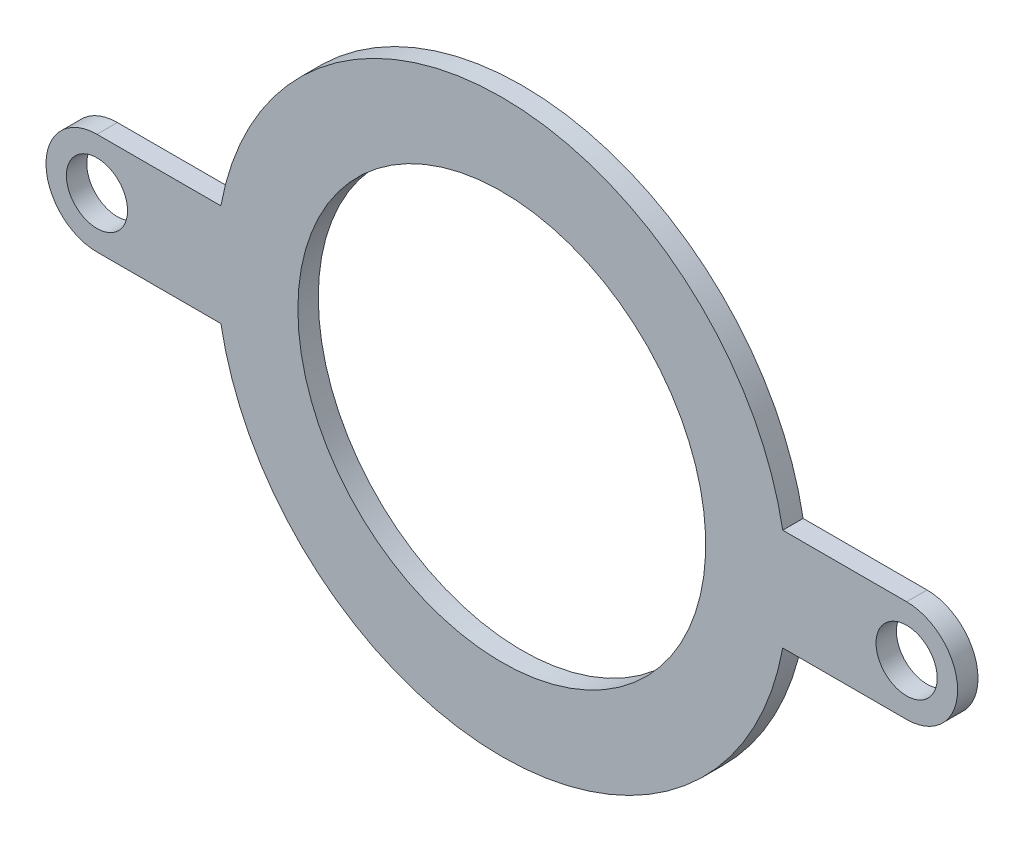
ISO-10303-21;
HEADER;
FILE_DESCRIPTION(('STEP AP214'),'2;1');
FILE_NAME('part.step','',(''),(''),'','','');
FILE_SCHEMA(('AUTOMOTIVE_DESIGN { 1 0 10303 214 1 1 1 1 }'));
ENDSEC;
DATA;
#1=APPLICATION_CONTEXT('core data for automotive mechanical design processes');
#2=APPLICATION_PROTOCOL_DEFINITION('international standard','automotive_design',2000,#1);
#3=PRODUCT_CONTEXT('',#1,'mechanical');
#4=PRODUCT('Part','Part','',(#3));
#5=PRODUCT_RELATED_PRODUCT_CATEGORY('part','',(#4));
#6=PRODUCT_DEFINITION_FORMATION('','',#4);
#7=PRODUCT_DEFINITION_CONTEXT('part definition',#1,'design');
#8=PRODUCT_DEFINITION('design','',#6,#7);
#9=PRODUCT_DEFINITION_SHAPE('','',#8);
#10=(LENGTH_UNIT() NAMED_UNIT(*) SI_UNIT(.MILLI.,.METRE.));
#11=(NAMED_UNIT(*) PLANE_ANGLE_UNIT() SI_UNIT($,.RADIAN.));
#12=(NAMED_UNIT(*) SI_UNIT($,.STERADIAN.) SOLID_ANGLE_UNIT());
#13=UNCERTAINTY_MEASURE_WITH_UNIT(LENGTH_MEASURE(1.E-05),#10,'distance_accuracy_value','');
#14=(GEOMETRIC_REPRESENTATION_CONTEXT(3) GLOBAL_UNCERTAINTY_ASSIGNED_CONTEXT((#13)) GLOBAL_UNIT_ASSIGNED_CONTEXT((#10,
#11,#12)) REPRESENTATION_CONTEXT('',''));
#15=CARTESIAN_POINT('',(0.,0.,0.));
#16=DIRECTION('',(0.,0.,1.));
#17=DIRECTION('',(1.,0.,0.));
#18=AXIS2_PLACEMENT_3D('',#15,#16,#17);
#19=CARTESIAN_POINT('',(0.,0.,0.));
#20=DIRECTION('',(0.,0.,1.));
#21=DIRECTION('',(1.,0.,0.));
#22=AXIS2_PLACEMENT_3D('',#19,#20,#21);
#23=PLANE('',#22);
#24=CARTESIAN_POINT('',(-19.85,0.,0.));
#25=DIRECTION('',(0.,0.,-1.));
#26=DIRECTION('',(-1.,0.,0.));
#27=AXIS2_PLACEMENT_3D('',#24,#25,#26);
#28=CIRCLE('',#27,2.5);
#29=CARTESIAN_POINT('',(-19.85,2.5,0.));
#30=VERTEX_POINT('',#29);
#31=CARTESIAN_POINT('',(-19.85,-2.5,0.));
#32=VERTEX_POINT('',#31);
#33=EDGE_CURVE('E139',#30,#32,#28,.F.);
#34=ORIENTED_EDGE('',*,*,#33,.F.);
#35=DIRECTION('',(1.,0.,0.));
#36=VECTOR('',#35,1.);
#37=CARTESIAN_POINT('',(-16.8124886569779,2.5,0.));
#38=LINE('',#37,#36);
#39=CARTESIAN_POINT('',(-13.7749773139559,2.5,0.));
#40=VERTEX_POINT('',#39);
#41=EDGE_CURVE('E110',#40,#30,#38,.F.);
#42=ORIENTED_EDGE('',*,*,#41,.F.);
#43=CARTESIAN_POINT('',(0.,0.,0.));
#44=DIRECTION('',(0.,0.,-1.));
#45=DIRECTION('',(-1.,0.,0.));
#46=AXIS2_PLACEMENT_3D('',#43,#44,#45);
#47=CIRCLE('',#46,14.);
#48=CARTESIAN_POINT('',(13.7749773139559,2.5,0.));
#49=VERTEX_POINT('',#48);
#50=EDGE_CURVE('E117',#49,#40,#47,.F.);
#51=ORIENTED_EDGE('',*,*,#50,.F.);
#52=DIRECTION('',(1.,0.,0.));
#53=VECTOR('',#52,1.);
#54=CARTESIAN_POINT('',(16.8124886569779,2.5,0.));
#55=LINE('',#54,#53);
#56=CARTESIAN_POINT('',(19.85,2.5,0.));
#57=VERTEX_POINT('',#56);
#58=EDGE_CURVE('E116',#49,#57,#55,.T.);
#59=ORIENTED_EDGE('',*,*,#58,.T.);
#60=CARTESIAN_POINT('',(19.85,0.,0.));
#61=DIRECTION('',(0.,0.,-1.));
#62=DIRECTION('',(-1.,0.,0.));
#63=AXIS2_PLACEMENT_3D('',#60,#61,#62);
#64=CIRCLE('',#63,2.5);
#65=CARTESIAN_POINT('',(19.85,-2.5,0.));
#66=VERTEX_POINT('',#65);
#67=EDGE_CURVE('E85',#66,#57,#64,.F.);
#68=ORIENTED_EDGE('',*,*,#67,.F.);
#69=DIRECTION('',(1.,0.,0.));
#70=VECTOR('',#69,1.);
#71=CARTESIAN_POINT('',(16.8124886569779,-2.5,0.));
#72=LINE('',#71,#70);
#73=CARTESIAN_POINT('',(13.7749773139559,-2.5,0.));
#74=VERTEX_POINT('',#73);
#75=EDGE_CURVE('E82',#74,#66,#72,.T.);
#76=ORIENTED_EDGE('',*,*,#75,.F.);
#77=CARTESIAN_POINT('',(0.,0.,0.));
#78=DIRECTION('',(0.,0.,-1.));
#79=DIRECTION('',(-1.,0.,0.));
#80=AXIS2_PLACEMENT_3D('',#77,#78,#79);
#81=CIRCLE('',#80,14.);
#82=CARTESIAN_POINT('',(-13.7749773139559,-2.50000000000001,0.));
#83=VERTEX_POINT('',#82);
#84=EDGE_CURVE('E79',#83,#74,#81,.F.);
#85=ORIENTED_EDGE('',*,*,#84,.F.);
#86=DIRECTION('',(1.,0.,0.));
#87=VECTOR('',#86,1.);
#88=CARTESIAN_POINT('',(-16.8124886569779,-2.5,0.));
#89=LINE('',#88,#87);
#90=EDGE_CURVE('E97',#83,#32,#89,.F.);
#91=ORIENTED_EDGE('',*,*,#90,.T.);
#92=EDGE_LOOP('',(#34,#42,#51,#59,#68,#76,#85,#91));
#93=FACE_BOUND('',#92,.T.);
#94=CARTESIAN_POINT('',(0.,0.,0.));
#95=DIRECTION('',(0.,0.,-1.));
#96=DIRECTION('',(-1.,0.,0.));
#97=AXIS2_PLACEMENT_3D('',#94,#95,#96);
#98=CIRCLE('',#97,10.);
#99=CARTESIAN_POINT('',(-10.,0.,0.));
#100=VERTEX_POINT('',#99);
#101=EDGE_CURVE('E115',#100,#100,#98,.F.);
#102=ORIENTED_EDGE('',*,*,#101,.T.);
#103=EDGE_LOOP('',(#102));
#104=FACE_BOUND('',#103,.T.);
#105=CARTESIAN_POINT('',(19.85,0.,0.));
#106=DIRECTION('',(0.,0.,-1.));
#107=DIRECTION('',(-1.,0.,0.));
#108=AXIS2_PLACEMENT_3D('',#105,#106,#107);
#109=CIRCLE('',#108,1.5);
#110=CARTESIAN_POINT('',(18.35,0.,0.));
#111=VERTEX_POINT('',#110);
#112=EDGE_CURVE('E146',#111,#111,#109,.F.);
#113=ORIENTED_EDGE('',*,*,#112,.T.);
#114=EDGE_LOOP('',(#113));
#115=FACE_BOUND('',#114,.T.);
#116=CARTESIAN_POINT('',(-19.85,0.,0.));
#117=DIRECTION('',(0.,0.,-1.));
#118=DIRECTION('',(-1.,0.,0.));
#119=AXIS2_PLACEMENT_3D('',#116,#117,#118);
#120=CIRCLE('',#119,1.5);
#121=CARTESIAN_POINT('',(-21.35,0.,0.));
#122=VERTEX_POINT('',#121);
#123=EDGE_CURVE('E19',#122,#122,#120,.F.);
#124=ORIENTED_EDGE('',*,*,#123,.T.);
#125=EDGE_LOOP('',(#124));
#126=FACE_BOUND('',#125,.T.);
#127=ADVANCED_FACE('F16',(#93,#104,#115,#126),#23,.F.);
#128=CARTESIAN_POINT('',(-19.85,0.,1.));
#129=DIRECTION('',(0.,0.,-1.));
#130=DIRECTION('',(-1.,0.,0.));
#131=AXIS2_PLACEMENT_3D('',#128,#129,#130);
#132=CYLINDRICAL_SURFACE('',#131,1.5);
#133=ORIENTED_EDGE('',*,*,#123,.F.);
#134=EDGE_LOOP('',(#133));
#135=FACE_BOUND('',#134,.T.);
#136=CARTESIAN_POINT('',(-19.85,0.,1.));
#137=DIRECTION('',(0.,0.,-1.));
#138=DIRECTION('',(-1.,0.,0.));
#139=AXIS2_PLACEMENT_3D('',#136,#137,#138);
#140=CIRCLE('',#139,1.5);
#141=CARTESIAN_POINT('',(-21.35,0.,1.));
#142=VERTEX_POINT('',#141);
#143=EDGE_CURVE('E136',#142,#142,#140,.T.);
#144=ORIENTED_EDGE('',*,*,#143,.F.);
#145=EDGE_LOOP('',(#144));
#146=FACE_BOUND('',#145,.T.);
#147=ADVANCED_FACE('F154',(#135,#146),#132,.F.);
#148=CARTESIAN_POINT('',(19.85,0.,1.));
#149=DIRECTION('',(0.,0.,-1.));
#150=DIRECTION('',(-1.,0.,0.));
#151=AXIS2_PLACEMENT_3D('',#148,#149,#150);
#152=CYLINDRICAL_SURFACE('',#151,1.5);
#153=ORIENTED_EDGE('',*,*,#112,.F.);
#154=EDGE_LOOP('',(#153));
#155=FACE_BOUND('',#154,.T.);
#156=CARTESIAN_POINT('',(19.85,0.,1.));
#157=DIRECTION('',(0.,0.,-1.));
#158=DIRECTION('',(-1.,0.,0.));
#159=AXIS2_PLACEMENT_3D('',#156,#157,#158);
#160=CIRCLE('',#159,1.5);
#161=CARTESIAN_POINT('',(18.35,0.,1.));
#162=VERTEX_POINT('',#161);
#163=EDGE_CURVE('E133',#162,#162,#160,.T.);
#164=ORIENTED_EDGE('',*,*,#163,.F.);
#165=EDGE_LOOP('',(#164));
#166=FACE_BOUND('',#165,.T.);
#167=ADVANCED_FACE('F157',(#155,#166),#152,.F.);
#168=CARTESIAN_POINT('',(0.,0.,1.));
#169=DIRECTION('',(0.,0.,-1.));
#170=DIRECTION('',(-1.,0.,0.));
#171=AXIS2_PLACEMENT_3D('',#168,#169,#170);
#172=CYLINDRICAL_SURFACE('',#171,10.);
#173=ORIENTED_EDGE('',*,*,#101,.F.);
#174=EDGE_LOOP('',(#173));
#175=FACE_BOUND('',#174,.T.);
#176=CARTESIAN_POINT('',(0.,0.,1.));
#177=DIRECTION('',(0.,0.,-1.));
#178=DIRECTION('',(-1.,0.,0.));
#179=AXIS2_PLACEMENT_3D('',#176,#177,#178);
#180=CIRCLE('',#179,10.);
#181=CARTESIAN_POINT('',(-10.,0.,1.));
#182=VERTEX_POINT('',#181);
#183=EDGE_CURVE('E130',#182,#182,#180,.T.);
#184=ORIENTED_EDGE('',*,*,#183,.F.);
#185=EDGE_LOOP('',(#184));
#186=FACE_BOUND('',#185,.T.);
#187=ADVANCED_FACE('F196',(#175,#186),#172,.F.);
#188=CARTESIAN_POINT('',(-16.8124886569779,-2.5,1.));
#189=DIRECTION('',(0.,1.,0.));
#190=DIRECTION('',(0.,0.,1.));
#191=AXIS2_PLACEMENT_3D('',#188,#189,#190);
#192=PLANE('',#191);
#193=DIRECTION('',(0.,0.,-1.));
#194=VECTOR('',#193,1.);
#195=CARTESIAN_POINT('',(-13.7749773139559,-2.50000000000001,1.));
#196=LINE('',#195,#194);
#197=CARTESIAN_POINT('',(-13.7749773139559,-2.50000000000001,1.));
#198=VERTEX_POINT('',#197);
#199=EDGE_CURVE('E90',#198,#83,#196,.T.);
#200=ORIENTED_EDGE('',*,*,#199,.F.);
#201=DIRECTION('',(1.,0.,0.));
#202=VECTOR('',#201,1.);
#203=CARTESIAN_POINT('',(0.,-2.5,1.));
#204=LINE('',#203,#202);
#205=CARTESIAN_POINT('',(-19.85,-2.5,1.));
#206=VERTEX_POINT('',#205);
#207=EDGE_CURVE('E129',#206,#198,#204,.T.);
#208=ORIENTED_EDGE('',*,*,#207,.F.);
#209=DIRECTION('',(0.,0.,-1.));
#210=VECTOR('',#209,1.);
#211=CARTESIAN_POINT('',(-19.85,-2.5,1.));
#212=LINE('',#211,#210);
#213=EDGE_CURVE('E142',#32,#206,#212,.F.);
#214=ORIENTED_EDGE('',*,*,#213,.F.);
#215=ORIENTED_EDGE('',*,*,#90,.F.);
#216=EDGE_LOOP('',(#200,#208,#214,#215));
#217=FACE_BOUND('',#216,.T.);
#218=ADVANCED_FACE('F193',(#217),#192,.F.);
#219=CARTESIAN_POINT('',(0.,0.,1.));
#220=DIRECTION('',(0.,0.,-1.));
#221=DIRECTION('',(-1.,0.,0.));
#222=AXIS2_PLACEMENT_3D('',#219,#220,#221);
#223=CYLINDRICAL_SURFACE('',#222,14.);
#224=CARTESIAN_POINT('',(0.,0.,1.));
#225=DIRECTION('',(0.,0.,-1.));
#226=DIRECTION('',(-1.,0.,0.));
#227=AXIS2_PLACEMENT_3D('',#224,#225,#226);
#228=CIRCLE('',#227,14.);
#229=CARTESIAN_POINT('',(13.7749773139559,-2.5,1.));
#230=VERTEX_POINT('',#229);
#231=EDGE_CURVE('E127',#198,#230,#228,.F.);
#232=ORIENTED_EDGE('',*,*,#231,.F.);
#233=ORIENTED_EDGE('',*,*,#199,.T.);
#234=ORIENTED_EDGE('',*,*,#84,.T.);
#235=DIRECTION('',(0.,0.,1.));
#236=VECTOR('',#235,1.);
#237=CARTESIAN_POINT('',(13.7749773139559,-2.5,1.));
#238=LINE('',#237,#236);
#239=EDGE_CURVE('E89',#230,#74,#238,.F.);
#240=ORIENTED_EDGE('',*,*,#239,.F.);
#241=EDGE_LOOP('',(#232,#233,#234,#240));
#242=FACE_BOUND('',#241,.T.);
#243=ADVANCED_FACE('F95',(#242),#223,.T.);
#244=CARTESIAN_POINT('',(16.8124886569779,-2.5,1.));
#245=DIRECTION('',(0.,-1.,0.));
#246=DIRECTION('',(1.,0.,0.));
#247=AXIS2_PLACEMENT_3D('',#244,#245,#246);
#248=PLANE('',#247);
#249=DIRECTION('',(1.,0.,0.));
#250=VECTOR('',#249,1.);
#251=CARTESIAN_POINT('',(0.,-2.5,1.));
#252=LINE('',#251,#250);
#253=CARTESIAN_POINT('',(19.85,-2.5,1.));
#254=VERTEX_POINT('',#253);
#255=EDGE_CURVE('E101',#230,#254,#252,.T.);
#256=ORIENTED_EDGE('',*,*,#255,.F.);
#257=ORIENTED_EDGE('',*,*,#239,.T.);
#258=ORIENTED_EDGE('',*,*,#75,.T.);
#259=DIRECTION('',(0.,0.,-1.));
#260=VECTOR('',#259,1.);
#261=CARTESIAN_POINT('',(19.85,-2.5,1.));
#262=LINE('',#261,#260);
#263=EDGE_CURVE('E104',#254,#66,#262,.T.);
#264=ORIENTED_EDGE('',*,*,#263,.F.);
#265=EDGE_LOOP('',(#256,#257,#258,#264));
#266=FACE_BOUND('',#265,.T.);
#267=ADVANCED_FACE('F99',(#266),#248,.T.);
#268=CARTESIAN_POINT('',(19.85,0.,1.));
#269=DIRECTION('',(0.,0.,-1.));
#270=DIRECTION('',(-1.,0.,0.));
#271=AXIS2_PLACEMENT_3D('',#268,#269,#270);
#272=CYLINDRICAL_SURFACE('',#271,2.5);
#273=CARTESIAN_POINT('',(19.85,0.,1.));
#274=DIRECTION('',(0.,0.,-1.));
#275=DIRECTION('',(-1.,0.,0.));
#276=AXIS2_PLACEMENT_3D('',#273,#274,#275);
#277=CIRCLE('',#276,2.5);
#278=CARTESIAN_POINT('',(19.85,2.5,1.));
#279=VERTEX_POINT('',#278);
#280=EDGE_CURVE('E124',#254,#279,#277,.F.);
#281=ORIENTED_EDGE('',*,*,#280,.F.);
#282=ORIENTED_EDGE('',*,*,#263,.T.);
#283=ORIENTED_EDGE('',*,*,#67,.T.);
#284=DIRECTION('',(0.,0.,-1.));
#285=VECTOR('',#284,1.);
#286=CARTESIAN_POINT('',(19.85,2.5,1.));
#287=LINE('',#286,#285);
#288=EDGE_CURVE('E118',#57,#279,#287,.F.);
#289=ORIENTED_EDGE('',*,*,#288,.T.);
#290=EDGE_LOOP('',(#281,#282,#283,#289));
#291=FACE_BOUND('',#290,.T.);
#292=ADVANCED_FACE('F184',(#291),#272,.T.);
#293=CARTESIAN_POINT('',(16.8124886569779,2.5,1.));
#294=DIRECTION('',(0.,-1.,0.));
#295=DIRECTION('',(0.,0.,-1.));
#296=AXIS2_PLACEMENT_3D('',#293,#294,#295);
#297=PLANE('',#296);
#298=DIRECTION('',(0.,0.,-1.));
#299=VECTOR('',#298,1.);
#300=CARTESIAN_POINT('',(13.7749773139559,2.5,1.));
#301=LINE('',#300,#299);
#302=CARTESIAN_POINT('',(13.7749773139559,2.5,1.));
#303=VERTEX_POINT('',#302);
#304=EDGE_CURVE('E113',#303,#49,#301,.T.);
#305=ORIENTED_EDGE('',*,*,#304,.F.);
#306=DIRECTION('',(1.,0.,0.));
#307=VECTOR('',#306,1.);
#308=CARTESIAN_POINT('',(0.,2.5,1.));
#309=LINE('',#308,#307);
#310=EDGE_CURVE('E123',#279,#303,#309,.F.);
#311=ORIENTED_EDGE('',*,*,#310,.F.);
#312=ORIENTED_EDGE('',*,*,#288,.F.);
#313=ORIENTED_EDGE('',*,*,#58,.F.);
#314=EDGE_LOOP('',(#305,#311,#312,#313));
#315=FACE_BOUND('',#314,.T.);
#316=ADVANCED_FACE('F180',(#315),#297,.F.);
#317=CARTESIAN_POINT('',(0.,0.,1.));
#318=DIRECTION('',(0.,0.,-1.));
#319=DIRECTION('',(-1.,0.,0.));
#320=AXIS2_PLACEMENT_3D('',#317,#318,#319);
#321=CYLINDRICAL_SURFACE('',#320,14.);
#322=CARTESIAN_POINT('',(0.,0.,1.));
#323=DIRECTION('',(0.,0.,-1.));
#324=DIRECTION('',(-1.,0.,0.));
#325=AXIS2_PLACEMENT_3D('',#322,#323,#324);
#326=CIRCLE('',#325,14.);
#327=CARTESIAN_POINT('',(-13.7749773139559,2.5,1.));
#328=VERTEX_POINT('',#327);
#329=EDGE_CURVE('E120',#303,#328,#326,.F.);
#330=ORIENTED_EDGE('',*,*,#329,.F.);
#331=ORIENTED_EDGE('',*,*,#304,.T.);
#332=ORIENTED_EDGE('',*,*,#50,.T.);
#333=DIRECTION('',(0.,0.,1.));
#334=VECTOR('',#333,1.);
#335=CARTESIAN_POINT('',(-13.7749773139559,2.5,1.));
#336=LINE('',#335,#334);
#337=EDGE_CURVE('E112',#328,#40,#336,.F.);
#338=ORIENTED_EDGE('',*,*,#337,.F.);
#339=EDGE_LOOP('',(#330,#331,#332,#338));
#340=FACE_BOUND('',#339,.T.);
#341=ADVANCED_FACE('F177',(#340),#321,.T.);
#342=CARTESIAN_POINT('',(-16.8124886569779,2.5,1.));
#343=DIRECTION('',(0.,1.,0.));
#344=DIRECTION('',(0.,0.,1.));
#345=AXIS2_PLACEMENT_3D('',#342,#343,#344);
#346=PLANE('',#345);
#347=DIRECTION('',(1.,0.,0.));
#348=VECTOR('',#347,1.);
#349=CARTESIAN_POINT('',(0.,2.5,1.));
#350=LINE('',#349,#348);
#351=CARTESIAN_POINT('',(-19.85,2.5,1.));
#352=VERTEX_POINT('',#351);
#353=EDGE_CURVE('E25',#328,#352,#350,.F.);
#354=ORIENTED_EDGE('',*,*,#353,.F.);
#355=ORIENTED_EDGE('',*,*,#337,.T.);
#356=ORIENTED_EDGE('',*,*,#41,.T.);
#357=DIRECTION('',(0.,0.,-1.));
#358=VECTOR('',#357,1.);
#359=CARTESIAN_POINT('',(-19.85,2.5,1.));
#360=LINE('',#359,#358);
#361=EDGE_CURVE('E34',#352,#30,#360,.T.);
#362=ORIENTED_EDGE('',*,*,#361,.F.);
#363=EDGE_LOOP('',(#354,#355,#356,#362));
#364=FACE_BOUND('',#363,.T.);
#365=ADVANCED_FACE('F169',(#364),#346,.T.);
#366=CARTESIAN_POINT('',(-19.85,0.,1.));
#367=DIRECTION('',(0.,0.,-1.));
#368=DIRECTION('',(-1.,0.,0.));
#369=AXIS2_PLACEMENT_3D('',#366,#367,#368);
#370=CYLINDRICAL_SURFACE('',#369,2.5);
#371=CARTESIAN_POINT('',(-19.85,0.,1.));
#372=DIRECTION('',(0.,0.,-1.));
#373=DIRECTION('',(-1.,0.,0.));
#374=AXIS2_PLACEMENT_3D('',#371,#372,#373);
#375=CIRCLE('',#374,2.5);
#376=EDGE_CURVE('E10',#352,#206,#375,.F.);
#377=ORIENTED_EDGE('',*,*,#376,.F.);
#378=ORIENTED_EDGE('',*,*,#361,.T.);
#379=ORIENTED_EDGE('',*,*,#33,.T.);
#380=ORIENTED_EDGE('',*,*,#213,.T.);
#381=EDGE_LOOP('',(#377,#378,#379,#380));
#382=FACE_BOUND('',#381,.T.);
#383=ADVANCED_FACE('F162',(#382),#370,.T.);
#384=CARTESIAN_POINT('',(0.,0.,1.));
#385=DIRECTION('',(0.,0.,1.));
#386=DIRECTION('',(1.,0.,0.));
#387=AXIS2_PLACEMENT_3D('',#384,#385,#386);
#388=PLANE('',#387);
#389=ORIENTED_EDGE('',*,*,#353,.T.);
#390=ORIENTED_EDGE('',*,*,#376,.T.);
#391=ORIENTED_EDGE('',*,*,#207,.T.);
#392=ORIENTED_EDGE('',*,*,#231,.T.);
#393=ORIENTED_EDGE('',*,*,#255,.T.);
#394=ORIENTED_EDGE('',*,*,#280,.T.);
#395=ORIENTED_EDGE('',*,*,#310,.T.);
#396=ORIENTED_EDGE('',*,*,#329,.T.);
#397=EDGE_LOOP('',(#389,#390,#391,#392,#393,#394,#395,#396));
#398=FACE_BOUND('',#397,.T.);
#399=ORIENTED_EDGE('',*,*,#183,.T.);
#400=EDGE_LOOP('',(#399));
#401=FACE_BOUND('',#400,.T.);
#402=ORIENTED_EDGE('',*,*,#163,.T.);
#403=EDGE_LOOP('',(#402));
#404=FACE_BOUND('',#403,.T.);
#405=ORIENTED_EDGE('',*,*,#143,.T.);
#406=EDGE_LOOP('',(#405));
#407=FACE_BOUND('',#406,.T.);
#408=ADVANCED_FACE('F160',(#398,#401,#404,#407),#388,.T.);
#409=CLOSED_SHELL('',(#127,#147,#167,#187,#218,#243,#267,#292,#316,#341,#365,#383,#408));
#410=MANIFOLD_SOLID_BREP('B1',#409);
#411=ADVANCED_BREP_SHAPE_REPRESENTATION('',(#18,#410),#14);
#412=SHAPE_DEFINITION_REPRESENTATION(#9,#411);
ENDSEC;
END-ISO-10303-21;
